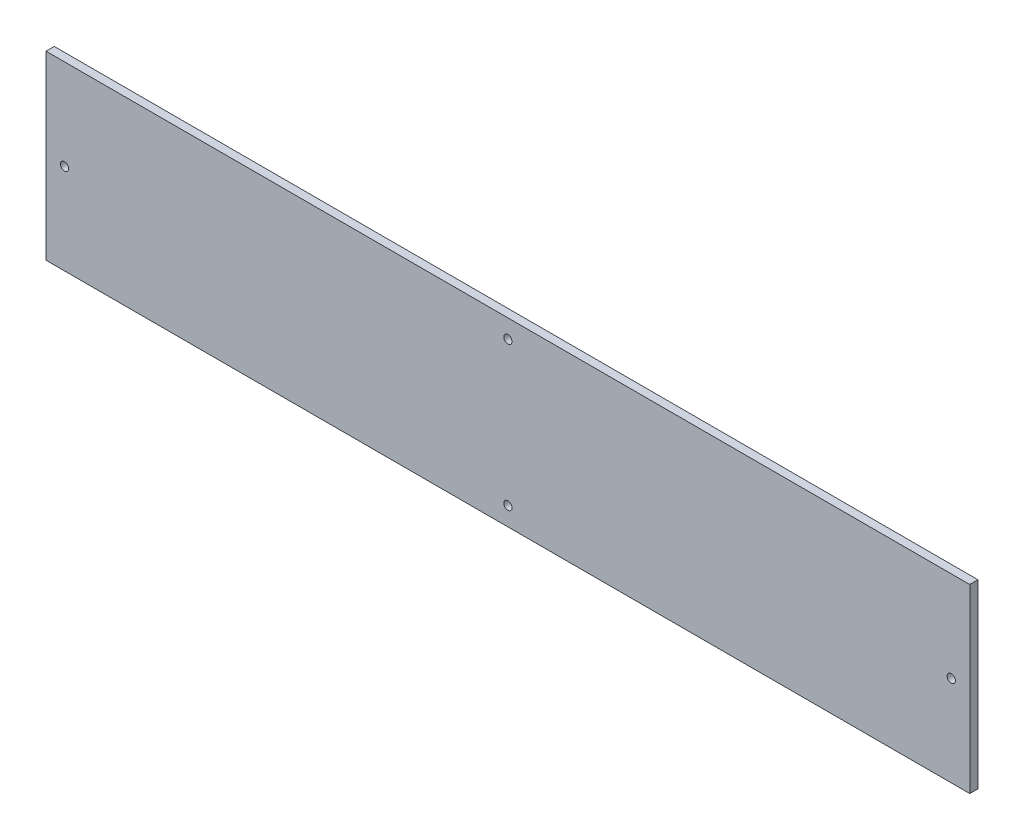
ISO-10303-21;
HEADER;
FILE_DESCRIPTION(('STEP AP214'),'2;1');
FILE_NAME('part.step','',(''),(''),'','','');
FILE_SCHEMA(('AUTOMOTIVE_DESIGN { 1 0 10303 214 1 1 1 1 }'));
ENDSEC;
DATA;
#1=APPLICATION_CONTEXT('core data for automotive mechanical design processes');
#2=APPLICATION_PROTOCOL_DEFINITION('international standard','automotive_design',2000,#1);
#3=PRODUCT_CONTEXT('',#1,'mechanical');
#4=PRODUCT('Part','Part','',(#3));
#5=PRODUCT_RELATED_PRODUCT_CATEGORY('part','',(#4));
#6=PRODUCT_DEFINITION_FORMATION('','',#4);
#7=PRODUCT_DEFINITION_CONTEXT('part definition',#1,'design');
#8=PRODUCT_DEFINITION('design','',#6,#7);
#9=PRODUCT_DEFINITION_SHAPE('','',#8);
#10=(LENGTH_UNIT() NAMED_UNIT(*) SI_UNIT(.MILLI.,.METRE.));
#11=(NAMED_UNIT(*) PLANE_ANGLE_UNIT() SI_UNIT($,.RADIAN.));
#12=(NAMED_UNIT(*) SI_UNIT($,.STERADIAN.) SOLID_ANGLE_UNIT());
#13=UNCERTAINTY_MEASURE_WITH_UNIT(LENGTH_MEASURE(1.E-05),#10,'distance_accuracy_value','');
#14=(GEOMETRIC_REPRESENTATION_CONTEXT(3) GLOBAL_UNCERTAINTY_ASSIGNED_CONTEXT((#13)) GLOBAL_UNIT_ASSIGNED_CONTEXT((#10,
#11,#12)) REPRESENTATION_CONTEXT('',''));
#15=CARTESIAN_POINT('',(0.,0.,0.));
#16=DIRECTION('',(0.,0.,1.));
#17=DIRECTION('',(1.,0.,0.));
#18=AXIS2_PLACEMENT_3D('',#15,#16,#17);
#19=CARTESIAN_POINT('',(0.,0.,4.));
#20=DIRECTION('',(0.,0.,1.));
#21=DIRECTION('',(1.,0.,0.));
#22=AXIS2_PLACEMENT_3D('',#19,#20,#21);
#23=PLANE('',#22);
#24=CARTESIAN_POINT('',(-440.,43.9999999999999,4.));
#25=DIRECTION('',(0.,0.,1.));
#26=DIRECTION('',(-1.,0.,0.));
#27=AXIS2_PLACEMENT_3D('',#24,#25,#26);
#28=CIRCLE('',#27,2.);
#29=CARTESIAN_POINT('',(-442.,43.9999999999999,4.));
#30=VERTEX_POINT('',#29);
#31=EDGE_CURVE('E123',#30,#30,#28,.T.);
#32=ORIENTED_EDGE('',*,*,#31,.F.);
#33=EDGE_LOOP('',(#32));
#34=FACE_BOUND('',#33,.T.);
#35=CARTESIAN_POINT('',(-224.5,78.9999999999999,4.));
#36=DIRECTION('',(0.,0.,1.));
#37=DIRECTION('',(1.,0.,0.));
#38=AXIS2_PLACEMENT_3D('',#35,#36,#37);
#39=CIRCLE('',#38,2.);
#40=CARTESIAN_POINT('',(-222.5,78.9999999999999,4.));
#41=VERTEX_POINT('',#40);
#42=EDGE_CURVE('E102',#41,#41,#39,.T.);
#43=ORIENTED_EDGE('',*,*,#42,.F.);
#44=EDGE_LOOP('',(#43));
#45=FACE_BOUND('',#44,.T.);
#46=DIRECTION('',(0.,1.,0.));
#47=VECTOR('',#46,1.);
#48=CARTESIAN_POINT('',(0.,0.,4.));
#49=LINE('',#48,#47);
#50=CARTESIAN_POINT('',(0.,0.,4.));
#51=VERTEX_POINT('',#50);
#52=CARTESIAN_POINT('',(0.,88.,4.));
#53=VERTEX_POINT('',#52);
#54=EDGE_CURVE('E87',#51,#53,#49,.T.);
#55=ORIENTED_EDGE('',*,*,#54,.T.);
#56=DIRECTION('',(-1.,0.,0.));
#57=VECTOR('',#56,1.);
#58=CARTESIAN_POINT('',(0.,88.,4.));
#59=LINE('',#58,#57);
#60=CARTESIAN_POINT('',(-449.,87.9999999999999,4.));
#61=VERTEX_POINT('',#60);
#62=EDGE_CURVE('E82',#53,#61,#59,.T.);
#63=ORIENTED_EDGE('',*,*,#62,.T.);
#64=DIRECTION('',(0.,-1.,0.));
#65=VECTOR('',#64,1.);
#66=CARTESIAN_POINT('',(-449.,0.,4.));
#67=LINE('',#66,#65);
#68=CARTESIAN_POINT('',(-449.,0.,4.));
#69=VERTEX_POINT('',#68);
#70=EDGE_CURVE('E85',#61,#69,#67,.T.);
#71=ORIENTED_EDGE('',*,*,#70,.T.);
#72=DIRECTION('',(1.,0.,0.));
#73=VECTOR('',#72,1.);
#74=CARTESIAN_POINT('',(0.,0.,4.));
#75=LINE('',#74,#73);
#76=EDGE_CURVE('E52',#69,#51,#75,.T.);
#77=ORIENTED_EDGE('',*,*,#76,.T.);
#78=EDGE_LOOP('',(#55,#63,#71,#77));
#79=FACE_BOUND('',#78,.T.);
#80=CARTESIAN_POINT('',(-9.,43.9999999999999,4.));
#81=DIRECTION('',(0.,0.,1.));
#82=DIRECTION('',(1.,0.,0.));
#83=AXIS2_PLACEMENT_3D('',#80,#81,#82);
#84=CIRCLE('',#83,2.);
#85=CARTESIAN_POINT('',(-7.,43.9999999999999,4.));
#86=VERTEX_POINT('',#85);
#87=EDGE_CURVE('E117',#86,#86,#84,.T.);
#88=ORIENTED_EDGE('',*,*,#87,.F.);
#89=EDGE_LOOP('',(#88));
#90=FACE_BOUND('',#89,.T.);
#91=CARTESIAN_POINT('',(-224.5,8.99999999999998,4.));
#92=DIRECTION('',(0.,0.,1.));
#93=DIRECTION('',(-1.,0.,0.));
#94=AXIS2_PLACEMENT_3D('',#91,#92,#93);
#95=CIRCLE('',#94,2.);
#96=CARTESIAN_POINT('',(-226.5,8.99999999999998,4.));
#97=VERTEX_POINT('',#96);
#98=EDGE_CURVE('E129',#97,#97,#95,.T.);
#99=ORIENTED_EDGE('',*,*,#98,.F.);
#100=EDGE_LOOP('',(#99));
#101=FACE_BOUND('',#100,.T.);
#102=ADVANCED_FACE('F35',(#34,#45,#79,#90,#101),#23,.T.);
#103=CARTESIAN_POINT('',(0.,0.,0.));
#104=DIRECTION('',(0.,0.,1.));
#105=DIRECTION('',(1.,0.,0.));
#106=AXIS2_PLACEMENT_3D('',#103,#104,#105);
#107=PLANE('',#106);
#108=CARTESIAN_POINT('',(-440.,43.9999999999999,0.));
#109=DIRECTION('',(0.,0.,1.));
#110=DIRECTION('',(-1.,0.,0.));
#111=AXIS2_PLACEMENT_3D('',#108,#109,#110);
#112=CIRCLE('',#111,2.);
#113=CARTESIAN_POINT('',(-442.,43.9999999999999,0.));
#114=VERTEX_POINT('',#113);
#115=EDGE_CURVE('E126',#114,#114,#112,.T.);
#116=ORIENTED_EDGE('',*,*,#115,.T.);
#117=EDGE_LOOP('',(#116));
#118=FACE_BOUND('',#117,.T.);
#119=CARTESIAN_POINT('',(-224.5,78.9999999999999,0.));
#120=DIRECTION('',(0.,0.,1.));
#121=DIRECTION('',(1.,0.,0.));
#122=AXIS2_PLACEMENT_3D('',#119,#120,#121);
#123=CIRCLE('',#122,2.);
#124=CARTESIAN_POINT('',(-222.5,78.9999999999999,0.));
#125=VERTEX_POINT('',#124);
#126=EDGE_CURVE('E114',#125,#125,#123,.T.);
#127=ORIENTED_EDGE('',*,*,#126,.T.);
#128=EDGE_LOOP('',(#127));
#129=FACE_BOUND('',#128,.T.);
#130=DIRECTION('',(0.,1.,0.));
#131=VECTOR('',#130,1.);
#132=CARTESIAN_POINT('',(0.,0.,0.));
#133=LINE('',#132,#131);
#134=CARTESIAN_POINT('',(0.,0.,0.));
#135=VERTEX_POINT('',#134);
#136=CARTESIAN_POINT('',(0.,88.,0.));
#137=VERTEX_POINT('',#136);
#138=EDGE_CURVE('E99',#135,#137,#133,.T.);
#139=ORIENTED_EDGE('',*,*,#138,.F.);
#140=DIRECTION('',(1.,0.,0.));
#141=VECTOR('',#140,1.);
#142=CARTESIAN_POINT('',(0.,0.,0.));
#143=LINE('',#142,#141);
#144=CARTESIAN_POINT('',(-449.,0.,0.));
#145=VERTEX_POINT('',#144);
#146=EDGE_CURVE('E75',#145,#135,#143,.T.);
#147=ORIENTED_EDGE('',*,*,#146,.F.);
#148=DIRECTION('',(0.,-1.,0.));
#149=VECTOR('',#148,1.);
#150=CARTESIAN_POINT('',(-449.,0.,0.));
#151=LINE('',#150,#149);
#152=CARTESIAN_POINT('',(-449.,87.9999999999999,0.));
#153=VERTEX_POINT('',#152);
#154=EDGE_CURVE('E69',#153,#145,#151,.T.);
#155=ORIENTED_EDGE('',*,*,#154,.F.);
#156=DIRECTION('',(-1.,0.,0.));
#157=VECTOR('',#156,1.);
#158=CARTESIAN_POINT('',(0.,88.,0.));
#159=LINE('',#158,#157);
#160=EDGE_CURVE('E91',#137,#153,#159,.T.);
#161=ORIENTED_EDGE('',*,*,#160,.F.);
#162=EDGE_LOOP('',(#139,#147,#155,#161));
#163=FACE_BOUND('',#162,.T.);
#164=CARTESIAN_POINT('',(-9.,43.9999999999999,0.));
#165=DIRECTION('',(0.,0.,1.));
#166=DIRECTION('',(1.,0.,0.));
#167=AXIS2_PLACEMENT_3D('',#164,#165,#166);
#168=CIRCLE('',#167,2.);
#169=CARTESIAN_POINT('',(-7.,43.9999999999999,0.));
#170=VERTEX_POINT('',#169);
#171=EDGE_CURVE('E120',#170,#170,#168,.T.);
#172=ORIENTED_EDGE('',*,*,#171,.T.);
#173=EDGE_LOOP('',(#172));
#174=FACE_BOUND('',#173,.T.);
#175=CARTESIAN_POINT('',(-224.5,8.99999999999998,0.));
#176=DIRECTION('',(0.,0.,1.));
#177=DIRECTION('',(-1.,0.,0.));
#178=AXIS2_PLACEMENT_3D('',#175,#176,#177);
#179=CIRCLE('',#178,2.);
#180=CARTESIAN_POINT('',(-226.5,8.99999999999998,0.));
#181=VERTEX_POINT('',#180);
#182=EDGE_CURVE('E132',#181,#181,#179,.T.);
#183=ORIENTED_EDGE('',*,*,#182,.T.);
#184=EDGE_LOOP('',(#183));
#185=FACE_BOUND('',#184,.T.);
#186=ADVANCED_FACE('F110',(#118,#129,#163,#174,#185),#107,.F.);
#187=CARTESIAN_POINT('',(0.,0.,4.));
#188=DIRECTION('',(-1.,0.,0.));
#189=DIRECTION('',(0.,-1.,0.));
#190=AXIS2_PLACEMENT_3D('',#187,#188,#189);
#191=PLANE('',#190);
#192=ORIENTED_EDGE('',*,*,#138,.T.);
#193=DIRECTION('',(0.,0.,-1.));
#194=VECTOR('',#193,1.);
#195=CARTESIAN_POINT('',(0.,88.,4.));
#196=LINE('',#195,#194);
#197=EDGE_CURVE('E11',#53,#137,#196,.T.);
#198=ORIENTED_EDGE('',*,*,#197,.F.);
#199=ORIENTED_EDGE('',*,*,#54,.F.);
#200=DIRECTION('',(0.,0.,-1.));
#201=VECTOR('',#200,1.);
#202=CARTESIAN_POINT('',(0.,0.,4.));
#203=LINE('',#202,#201);
#204=EDGE_CURVE('E95',#51,#135,#203,.T.);
#205=ORIENTED_EDGE('',*,*,#204,.T.);
#206=EDGE_LOOP('',(#192,#198,#199,#205));
#207=FACE_BOUND('',#206,.T.);
#208=ADVANCED_FACE('F37',(#207),#191,.F.);
#209=CARTESIAN_POINT('',(0.,88.,4.));
#210=DIRECTION('',(0.,-1.,0.));
#211=DIRECTION('',(1.,0.,0.));
#212=AXIS2_PLACEMENT_3D('',#209,#210,#211);
#213=PLANE('',#212);
#214=ORIENTED_EDGE('',*,*,#160,.T.);
#215=DIRECTION('',(0.,0.,-1.));
#216=VECTOR('',#215,1.);
#217=CARTESIAN_POINT('',(-449.,87.9999999999999,4.));
#218=LINE('',#217,#216);
#219=EDGE_CURVE('E44',#61,#153,#218,.T.);
#220=ORIENTED_EDGE('',*,*,#219,.F.);
#221=ORIENTED_EDGE('',*,*,#62,.F.);
#222=ORIENTED_EDGE('',*,*,#197,.T.);
#223=EDGE_LOOP('',(#214,#220,#221,#222));
#224=FACE_BOUND('',#223,.T.);
#225=ADVANCED_FACE('F90',(#224),#213,.F.);
#226=CARTESIAN_POINT('',(-449.,0.,4.));
#227=DIRECTION('',(1.,0.,0.));
#228=DIRECTION('',(0.,1.,0.));
#229=AXIS2_PLACEMENT_3D('',#226,#227,#228);
#230=PLANE('',#229);
#231=ORIENTED_EDGE('',*,*,#154,.T.);
#232=DIRECTION('',(0.,0.,-1.));
#233=VECTOR('',#232,1.);
#234=CARTESIAN_POINT('',(-449.,0.,4.));
#235=LINE('',#234,#233);
#236=EDGE_CURVE('E92',#69,#145,#235,.T.);
#237=ORIENTED_EDGE('',*,*,#236,.F.);
#238=ORIENTED_EDGE('',*,*,#70,.F.);
#239=ORIENTED_EDGE('',*,*,#219,.T.);
#240=EDGE_LOOP('',(#231,#237,#238,#239));
#241=FACE_BOUND('',#240,.T.);
#242=ADVANCED_FACE('F93',(#241),#230,.F.);
#243=CARTESIAN_POINT('',(0.,0.,4.));
#244=DIRECTION('',(0.,1.,0.));
#245=DIRECTION('',(-1.,0.,0.));
#246=AXIS2_PLACEMENT_3D('',#243,#244,#245);
#247=PLANE('',#246);
#248=ORIENTED_EDGE('',*,*,#146,.T.);
#249=ORIENTED_EDGE('',*,*,#204,.F.);
#250=ORIENTED_EDGE('',*,*,#76,.F.);
#251=ORIENTED_EDGE('',*,*,#236,.T.);
#252=EDGE_LOOP('',(#248,#249,#250,#251));
#253=FACE_BOUND('',#252,.T.);
#254=ADVANCED_FACE('F107',(#253),#247,.F.);
#255=CARTESIAN_POINT('',(-224.5,78.9999999999999,4.));
#256=DIRECTION('',(0.,0.,-1.));
#257=DIRECTION('',(-1.,0.,0.));
#258=AXIS2_PLACEMENT_3D('',#255,#256,#257);
#259=CYLINDRICAL_SURFACE('',#258,2.);
#260=ORIENTED_EDGE('',*,*,#42,.T.);
#261=EDGE_LOOP('',(#260));
#262=FACE_BOUND('',#261,.T.);
#263=ORIENTED_EDGE('',*,*,#126,.F.);
#264=EDGE_LOOP('',(#263));
#265=FACE_BOUND('',#264,.T.);
#266=ADVANCED_FACE('F152',(#262,#265),#259,.F.);
#267=CARTESIAN_POINT('',(-9.,43.9999999999999,4.));
#268=DIRECTION('',(0.,0.,-1.));
#269=DIRECTION('',(-1.,0.,0.));
#270=AXIS2_PLACEMENT_3D('',#267,#268,#269);
#271=CYLINDRICAL_SURFACE('',#270,2.);
#272=ORIENTED_EDGE('',*,*,#87,.T.);
#273=EDGE_LOOP('',(#272));
#274=FACE_BOUND('',#273,.T.);
#275=ORIENTED_EDGE('',*,*,#171,.F.);
#276=EDGE_LOOP('',(#275));
#277=FACE_BOUND('',#276,.T.);
#278=ADVANCED_FACE('F200',(#274,#277),#271,.F.);
#279=CARTESIAN_POINT('',(-440.,43.9999999999999,4.));
#280=DIRECTION('',(0.,0.,-1.));
#281=DIRECTION('',(-1.,0.,0.));
#282=AXIS2_PLACEMENT_3D('',#279,#280,#281);
#283=CYLINDRICAL_SURFACE('',#282,2.);
#284=ORIENTED_EDGE('',*,*,#31,.T.);
#285=EDGE_LOOP('',(#284));
#286=FACE_BOUND('',#285,.T.);
#287=ORIENTED_EDGE('',*,*,#115,.F.);
#288=EDGE_LOOP('',(#287));
#289=FACE_BOUND('',#288,.T.);
#290=ADVANCED_FACE('F208',(#286,#289),#283,.F.);
#291=CARTESIAN_POINT('',(-224.5,8.99999999999998,4.));
#292=DIRECTION('',(0.,0.,-1.));
#293=DIRECTION('',(-1.,0.,0.));
#294=AXIS2_PLACEMENT_3D('',#291,#292,#293);
#295=CYLINDRICAL_SURFACE('',#294,2.);
#296=ORIENTED_EDGE('',*,*,#98,.T.);
#297=EDGE_LOOP('',(#296));
#298=FACE_BOUND('',#297,.T.);
#299=ORIENTED_EDGE('',*,*,#182,.F.);
#300=EDGE_LOOP('',(#299));
#301=FACE_BOUND('',#300,.T.);
#302=ADVANCED_FACE('F138',(#298,#301),#295,.F.);
#303=CLOSED_SHELL('',(#102,#186,#208,#225,#242,#254,#266,#278,#290,#302));
#304=MANIFOLD_SOLID_BREP('B2',#303);
#305=ADVANCED_BREP_SHAPE_REPRESENTATION('',(#18,#304),#14);
#306=SHAPE_DEFINITION_REPRESENTATION(#9,#305);
ENDSEC;
END-ISO-10303-21;
